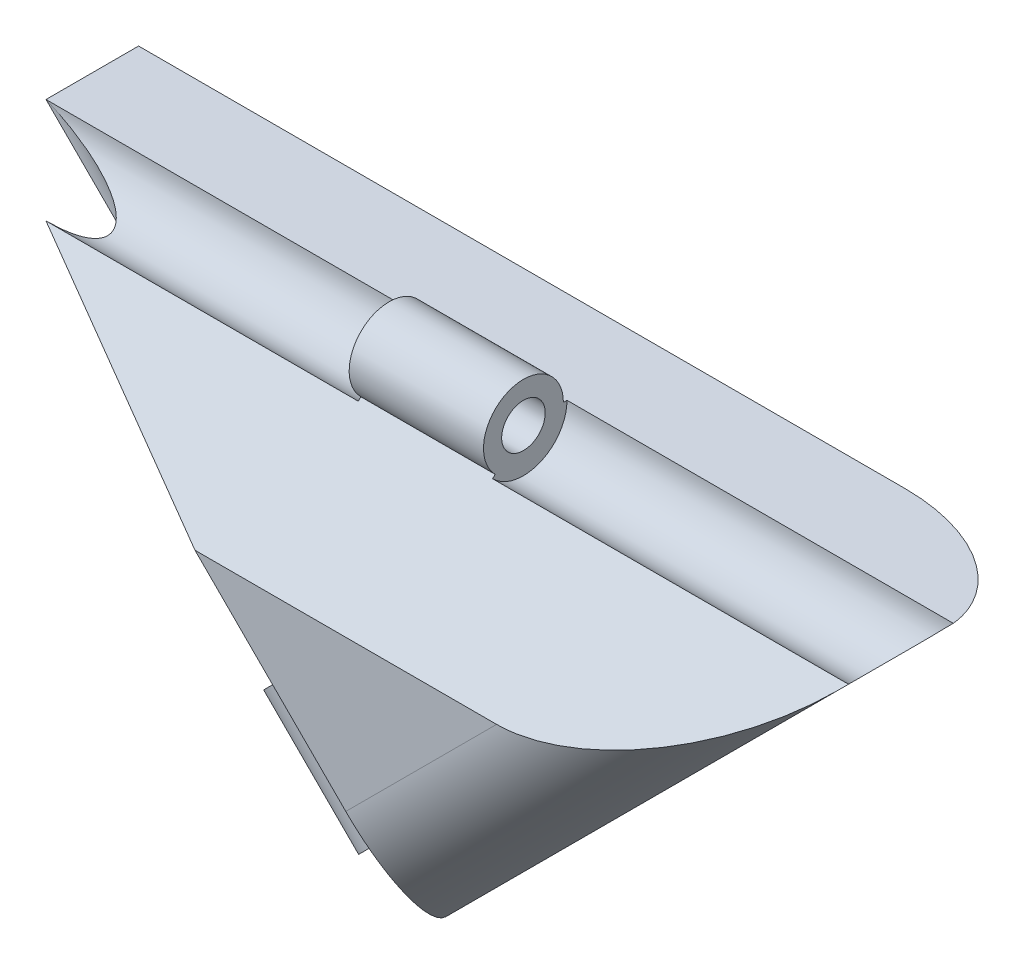
ISO-10303-21;
HEADER;
FILE_DESCRIPTION(('STEP AP214'),'2;1');
FILE_NAME('part.step','',(''),(''),'','','');
FILE_SCHEMA(('AUTOMOTIVE_DESIGN { 1 0 10303 214 1 1 1 1 }'));
ENDSEC;
DATA;
#1=APPLICATION_CONTEXT('core data for automotive mechanical design processes');
#2=APPLICATION_PROTOCOL_DEFINITION('international standard','automotive_design',2000,#1);
#3=PRODUCT_CONTEXT('',#1,'mechanical');
#4=PRODUCT('Part','Part','',(#3));
#5=PRODUCT_RELATED_PRODUCT_CATEGORY('part','',(#4));
#6=PRODUCT_DEFINITION_FORMATION('','',#4);
#7=PRODUCT_DEFINITION_CONTEXT('part definition',#1,'design');
#8=PRODUCT_DEFINITION('design','',#6,#7);
#9=PRODUCT_DEFINITION_SHAPE('','',#8);
#10=(LENGTH_UNIT() NAMED_UNIT(*) SI_UNIT(.MILLI.,.METRE.));
#11=(NAMED_UNIT(*) PLANE_ANGLE_UNIT() SI_UNIT($,.RADIAN.));
#12=(NAMED_UNIT(*) SI_UNIT($,.STERADIAN.) SOLID_ANGLE_UNIT());
#13=UNCERTAINTY_MEASURE_WITH_UNIT(LENGTH_MEASURE(1.E-05),#10,'distance_accuracy_value','');
#14=(GEOMETRIC_REPRESENTATION_CONTEXT(3) GLOBAL_UNCERTAINTY_ASSIGNED_CONTEXT((#13)) GLOBAL_UNIT_ASSIGNED_CONTEXT((#10,
#11,#12)) REPRESENTATION_CONTEXT('',''));
#15=CARTESIAN_POINT('',(0.,0.,0.));
#16=DIRECTION('',(0.,0.,1.));
#17=DIRECTION('',(1.,0.,0.));
#18=AXIS2_PLACEMENT_3D('',#15,#16,#17);
#19=CARTESIAN_POINT('',(-26.0999999999999,9.43333333333339,7.5));
#20=DIRECTION('',(0.707106781186546,-0.707106781186549,0.));
#21=DIRECTION('',(0.707106781186549,0.707106781186546,0.));
#22=AXIS2_PLACEMENT_3D('',#19,#20,#21);
#23=CYLINDRICAL_SURFACE('',#22,2.4);
#24=CARTESIAN_POINT('',(-7.91959594928932,-8.74707071737727,7.5));
#25=DIRECTION('',(0.707106781186547,-0.707106781186549,0.));
#26=DIRECTION('',(0.707106781186549,0.707106781186547,0.));
#27=AXIS2_PLACEMENT_3D('',#24,#25,#26);
#28=CIRCLE('',#27,2.4);
#29=CARTESIAN_POINT('',(-7.91959594928932,-8.74707071737727,5.1));
#30=VERTEX_POINT('',#29);
#31=CARTESIAN_POINT('',(-6.71959594928932,-7.54707071737727,9.19705627484771));
#32=VERTEX_POINT('',#31);
#33=EDGE_CURVE('E203',#30,#32,#28,.T.);
#34=ORIENTED_EDGE('',*,*,#33,.T.);
#35=DIRECTION('',(0.707106781186546,-0.707106781186549,0.));
#36=VECTOR('',#35,1.);
#37=CARTESIAN_POINT('',(-24.8999999999999,10.6333333333334,9.19705627484771));
#38=LINE('',#37,#36);
#39=CARTESIAN_POINT('',(-20.9029437251521,6.6362770584856,9.19705627484771));
#40=VERTEX_POINT('',#39);
#41=EDGE_CURVE('E230',#40,#32,#38,.T.);
#42=ORIENTED_EDGE('',*,*,#41,.F.);
#43=CARTESIAN_POINT('',(-24.9999999999998,8.33333333333331,7.5));
#44=DIRECTION('',(0.38268343236509,0.923879532511286,0.));
#45=DIRECTION('',(0.923879532511287,-0.38268343236509,0.));
#46=AXIS2_PLACEMENT_3D('',#43,#44,#45);
#47=ELLIPSE('',#46,6.27150223140659,2.4);
#48=CARTESIAN_POINT('',(-25.,8.3333333333333,5.1));
#49=VERTEX_POINT('',#48);
#50=EDGE_CURVE('E227',#49,#40,#47,.F.);
#51=ORIENTED_EDGE('',*,*,#50,.F.);
#52=DIRECTION('',(0.707106781186546,-0.707106781186549,0.));
#53=VECTOR('',#52,1.);
#54=CARTESIAN_POINT('',(-26.1,9.4333333333333,5.1));
#55=LINE('',#54,#53);
#56=EDGE_CURVE('E220',#30,#49,#55,.F.);
#57=ORIENTED_EDGE('',*,*,#56,.F.);
#58=EDGE_LOOP('',(#34,#42,#51,#57));
#59=FACE_BOUND('',#58,.T.);
#60=ADVANCED_FACE('F90',(#59),#23,.F.);
#61=CARTESIAN_POINT('',(-25.,8.33333333333331,7.5));
#62=DIRECTION('',(1.,0.,0.));
#63=DIRECTION('',(0.,0.,-1.));
#64=AXIS2_PLACEMENT_3D('',#61,#62,#63);
#65=CYLINDRICAL_SURFACE('',#64,2.4);
#66=DIRECTION('',(1.,0.,0.));
#67=VECTOR('',#66,1.);
#68=CARTESIAN_POINT('',(-25.,8.3333333333333,5.1));
#69=LINE('',#68,#67);
#70=CARTESIAN_POINT('',(-3.7,8.33333333333331,5.1));
#71=VERTEX_POINT('',#70);
#72=EDGE_CURVE('E286',#49,#71,#69,.T.);
#73=ORIENTED_EDGE('',*,*,#72,.F.);
#74=ORIENTED_EDGE('',*,*,#50,.T.);
#75=DIRECTION('',(1.,0.,0.));
#76=VECTOR('',#75,1.);
#77=CARTESIAN_POINT('',(-25.,6.6362770584856,9.19705627484771));
#78=LINE('',#77,#76);
#79=CARTESIAN_POINT('',(-3.7,6.6362770584856,9.19705627484771));
#80=VERTEX_POINT('',#79);
#81=EDGE_CURVE('E268',#80,#40,#78,.F.);
#82=ORIENTED_EDGE('',*,*,#81,.F.);
#83=CARTESIAN_POINT('',(-3.7,8.33333333333331,7.5));
#84=DIRECTION('',(1.,0.,0.));
#85=DIRECTION('',(0.,0.,-1.));
#86=AXIS2_PLACEMENT_3D('',#83,#84,#85);
#87=CIRCLE('',#86,2.4);
#88=EDGE_CURVE('E256',#80,#71,#87,.T.);
#89=ORIENTED_EDGE('',*,*,#88,.T.);
#90=EDGE_LOOP('',(#73,#74,#82,#89));
#91=FACE_BOUND('',#90,.T.);
#92=ADVANCED_FACE('F315',(#91),#65,.F.);
#93=CARTESIAN_POINT('',(-25.,8.3333333333333,15.));
#94=DIRECTION('',(0.,-1.,0.));
#95=DIRECTION('',(1.,0.,0.));
#96=AXIS2_PLACEMENT_3D('',#93,#94,#95);
#97=PLANE('',#96);
#98=CARTESIAN_POINT('',(3.7,8.33333333333331,5.1));
#99=VERTEX_POINT('',#98);
#100=CARTESIAN_POINT('',(24.9794023482358,8.3333333333333,5.1));
#101=VERTEX_POINT('',#100);
#102=EDGE_CURVE('E285',#99,#101,#69,.T.);
#103=ORIENTED_EDGE('',*,*,#102,.T.);
#104=CARTESIAN_POINT('',(17.221825406948,8.33333333333331,5.5));
#105=DIRECTION('',(0.,-1.,0.));
#106=DIRECTION('',(-1.,0.,0.));
#107=AXIS2_PLACEMENT_3D('',#104,#105,#106);
#108=ELLIPSE('',#107,7.77817459305203,5.5);
#109=CARTESIAN_POINT('',(17.221825406948,8.33333333333331,0.));
#110=VERTEX_POINT('',#109);
#111=EDGE_CURVE('E302',#101,#110,#108,.F.);
#112=ORIENTED_EDGE('',*,*,#111,.T.);
#113=DIRECTION('',(-1.,0.,0.));
#114=VECTOR('',#113,1.);
#115=CARTESIAN_POINT('',(-25.,8.3333333333333,0.));
#116=LINE('',#115,#114);
#117=CARTESIAN_POINT('',(-25.,8.3333333333333,0.));
#118=VERTEX_POINT('',#117);
#119=EDGE_CURVE('E279',#110,#118,#116,.T.);
#120=ORIENTED_EDGE('',*,*,#119,.T.);
#121=DIRECTION('',(0.,0.,-1.));
#122=VECTOR('',#121,1.);
#123=CARTESIAN_POINT('',(-25.,8.3333333333333,15.));
#124=LINE('',#123,#122);
#125=EDGE_CURVE('E281',#49,#118,#124,.T.);
#126=ORIENTED_EDGE('',*,*,#125,.F.);
#127=ORIENTED_EDGE('',*,*,#72,.T.);
#128=DIRECTION('',(0.,0.,1.));
#129=VECTOR('',#128,1.);
#130=CARTESIAN_POINT('',(-3.7,8.33333333333331,0.));
#131=LINE('',#130,#129);
#132=CARTESIAN_POINT('',(-3.7,8.33333333333331,5.3));
#133=VERTEX_POINT('',#132);
#134=EDGE_CURVE('E259',#71,#133,#131,.T.);
#135=ORIENTED_EDGE('',*,*,#134,.T.);
#136=DIRECTION('',(1.,0.,0.));
#137=VECTOR('',#136,1.);
#138=CARTESIAN_POINT('',(-3.7,8.33333333333331,5.3));
#139=LINE('',#138,#137);
#140=CARTESIAN_POINT('',(3.7,8.33333333333331,5.3));
#141=VERTEX_POINT('',#140);
#142=EDGE_CURVE('E266',#133,#141,#139,.T.);
#143=ORIENTED_EDGE('',*,*,#142,.T.);
#144=DIRECTION('',(0.,0.,1.));
#145=VECTOR('',#144,1.);
#146=CARTESIAN_POINT('',(3.7,8.33333333333331,0.));
#147=LINE('',#146,#145);
#148=EDGE_CURVE('E245',#99,#141,#147,.T.);
#149=ORIENTED_EDGE('',*,*,#148,.F.);
#150=EDGE_LOOP('',(#103,#112,#120,#126,#127,#135,#143,#149));
#151=FACE_BOUND('',#150,.T.);
#152=ADVANCED_FACE('F325',(#151),#97,.F.);
#153=CARTESIAN_POINT('',(0.,-16.6666666666666,15.));
#154=DIRECTION('',(0.707106781186546,0.707106781186549,0.));
#155=DIRECTION('',(-0.707106781186549,0.707106781186546,0.));
#156=AXIS2_PLACEMENT_3D('',#153,#154,#155);
#157=PLANE('',#156);
#158=DIRECTION('',(0.707106781186549,-0.707106781186546,0.));
#159=VECTOR('',#158,1.);
#160=CARTESIAN_POINT('',(0.,-16.6666666666666,0.));
#161=LINE('',#160,#159);
#162=CARTESIAN_POINT('',(-3.88908729652602,-12.7775793701406,0.));
#163=VERTEX_POINT('',#162);
#164=EDGE_CURVE('E277',#118,#163,#161,.T.);
#165=ORIENTED_EDGE('',*,*,#164,.T.);
#166=CARTESIAN_POINT('',(-3.88908729652602,-12.7775793701406,5.5));
#167=DIRECTION('',(0.707106781186546,0.707106781186549,0.));
#168=DIRECTION('',(-0.707106781186549,0.707106781186546,0.));
#169=AXIS2_PLACEMENT_3D('',#166,#167,#168);
#170=CIRCLE('',#169,5.5);
#171=CARTESIAN_POINT('',(-0.0102988258822018,-16.6563678407846,5.1));
#172=VERTEX_POINT('',#171);
#173=EDGE_CURVE('E370',#163,#172,#170,.F.);
#174=ORIENTED_EDGE('',*,*,#173,.T.);
#175=CARTESIAN_POINT('',(-2.68700576850896,-13.9796608981578,5.1));
#176=VERTEX_POINT('',#175);
#177=EDGE_CURVE('E229',#172,#176,#55,.F.);
#178=ORIENTED_EDGE('',*,*,#177,.T.);
#179=DIRECTION('',(0.,0.,-1.));
#180=VECTOR('',#179,1.);
#181=CARTESIAN_POINT('',(-2.68700576850888,-13.9796608981577,0.));
#182=LINE('',#181,#180);
#183=CARTESIAN_POINT('',(-2.68700576850888,-13.9796608981577,5.3));
#184=VERTEX_POINT('',#183);
#185=EDGE_CURVE('E428',#184,#176,#182,.T.);
#186=ORIENTED_EDGE('',*,*,#185,.F.);
#187=DIRECTION('',(0.707106781186546,-0.707106781186549,0.));
#188=VECTOR('',#187,1.);
#189=CARTESIAN_POINT('',(-7.91959594928932,-8.74707071737727,5.3));
#190=LINE('',#189,#188);
#191=CARTESIAN_POINT('',(-7.91959594928932,-8.74707071737727,5.3));
#192=VERTEX_POINT('',#191);
#193=EDGE_CURVE('E223',#192,#184,#190,.T.);
#194=ORIENTED_EDGE('',*,*,#193,.F.);
#195=DIRECTION('',(0.,0.,-1.));
#196=VECTOR('',#195,1.);
#197=CARTESIAN_POINT('',(-7.91959594928932,-8.74707071737727,0.));
#198=LINE('',#197,#196);
#199=EDGE_CURVE('E207',#192,#30,#198,.T.);
#200=ORIENTED_EDGE('',*,*,#199,.T.);
#201=ORIENTED_EDGE('',*,*,#56,.T.);
#202=ORIENTED_EDGE('',*,*,#125,.T.);
#203=EDGE_LOOP('',(#165,#174,#178,#186,#194,#200,#201,#202));
#204=FACE_BOUND('',#203,.T.);
#205=ADVANCED_FACE('F218',(#204),#157,.F.);
#206=CARTESIAN_POINT('',(0.,-16.6666666666666,15.));
#207=DIRECTION('',(-0.707106781186546,0.707106781186549,0.));
#208=DIRECTION('',(-0.707106781186549,-0.707106781186546,0.));
#209=AXIS2_PLACEMENT_3D('',#206,#207,#208);
#210=PLANE('',#209);
#211=DIRECTION('',(-0.577350269189627,-0.577350269189625,0.577350269189625));
#212=VECTOR('',#211,1.);
#213=CARTESIAN_POINT('',(5.83333333333331,-10.8333333333333,26.6666666666666));
#214=LINE('',#213,#212);
#215=CARTESIAN_POINT('',(23.3029437251523,6.6362770584856,9.19705627484771));
#216=VERTEX_POINT('',#215);
#217=CARTESIAN_POINT('',(23.,6.3333333333333,9.50000000000001));
#218=VERTEX_POINT('',#217);
#219=EDGE_CURVE('E273',#216,#218,#214,.T.);
#220=ORIENTED_EDGE('',*,*,#219,.T.);
#221=DIRECTION('',(0.707106781186549,0.707106781186546,0.));
#222=VECTOR('',#221,1.);
#223=CARTESIAN_POINT('',(0.,-16.6666666666666,9.5));
#224=LINE('',#223,#222);
#225=CARTESIAN_POINT('',(1.4142135623731,-15.2524531042935,9.5));
#226=VERTEX_POINT('',#225);
#227=EDGE_CURVE('E98',#218,#226,#224,.F.);
#228=ORIENTED_EDGE('',*,*,#227,.T.);
#229=DIRECTION('',(0.500000000000001,0.499999999999999,0.707106781186548));
#230=VECTOR('',#229,1.);
#231=CARTESIAN_POINT('',(1.5150162372171,-15.1516504294495,9.64255650988787));
#232=LINE('',#231,#230);
#233=CARTESIAN_POINT('',(1.20000000000001,-15.4666666666666,9.19705627484771));
#234=VERTEX_POINT('',#233);
#235=EDGE_CURVE('E412',#234,#226,#232,.T.);
#236=ORIENTED_EDGE('',*,*,#235,.F.);
#237=CARTESIAN_POINT('',(0.,-16.6666666666666,7.5));
#238=DIRECTION('',(0.707106781186546,-0.707106781186549,0.));
#239=DIRECTION('',(0.707106781186549,0.707106781186546,0.));
#240=AXIS2_PLACEMENT_3D('',#237,#238,#239);
#241=CIRCLE('',#240,2.4);
#242=CARTESIAN_POINT('',(0.938083151964687,-15.7285835147019,5.5));
#243=VERTEX_POINT('',#242);
#244=EDGE_CURVE('E414',#243,#234,#241,.T.);
#245=ORIENTED_EDGE('',*,*,#244,.F.);
#246=DIRECTION('',(0.707106781186549,0.707106781186546,0.));
#247=VECTOR('',#246,1.);
#248=CARTESIAN_POINT('',(25.,8.33333333333331,5.5));
#249=LINE('',#248,#247);
#250=CARTESIAN_POINT('',(23.6733500838578,7.00668341719115,5.5));
#251=VERTEX_POINT('',#250);
#252=EDGE_CURVE('E292',#243,#251,#249,.T.);
#253=ORIENTED_EDGE('',*,*,#252,.T.);
#254=CARTESIAN_POINT('',(25.,8.33333333333331,7.5));
#255=DIRECTION('',(-0.707106781186546,0.707106781186549,0.));
#256=DIRECTION('',(0.707106781186549,0.707106781186546,0.));
#257=AXIS2_PLACEMENT_3D('',#254,#255,#256);
#258=ELLIPSE('',#257,3.39411254969543,2.4);
#259=EDGE_CURVE('E275',#251,#216,#258,.T.);
#260=ORIENTED_EDGE('',*,*,#259,.T.);
#261=EDGE_LOOP('',(#220,#228,#236,#245,#253,#260));
#262=FACE_BOUND('',#261,.T.);
#263=ADVANCED_FACE('F320',(#262),#210,.F.);
#264=CARTESIAN_POINT('',(0.,0.,15.));
#265=DIRECTION('',(0.,0.,-1.));
#266=DIRECTION('',(-1.,0.,0.));
#267=AXIS2_PLACEMENT_3D('',#264,#265,#266);
#268=PLANE('',#267);
#269=DIRECTION('',(0.707106781186546,-0.707106781186549,0.));
#270=VECTOR('',#269,1.);
#271=CARTESIAN_POINT('',(-20.7966991411008,14.7366341922325,15.));
#272=LINE('',#271,#270);
#273=CARTESIAN_POINT('',(-6.89339828220169,0.833333333333312,15.));
#274=VERTEX_POINT('',#273);
#275=CARTESIAN_POINT('',(1.41421356237311,-7.47427851124149,15.));
#276=VERTEX_POINT('',#275);
#277=EDGE_CURVE('E410',#274,#276,#272,.T.);
#278=ORIENTED_EDGE('',*,*,#277,.T.);
#279=DIRECTION('',(0.707106781186549,0.707106781186546,0.));
#280=VECTOR('',#279,1.);
#281=CARTESIAN_POINT('',(4.4442460368073,-4.44424603680731,15.));
#282=LINE('',#281,#280);
#283=CARTESIAN_POINT('',(9.72182540694794,0.833333333333309,15.));
#284=VERTEX_POINT('',#283);
#285=EDGE_CURVE('E371',#276,#284,#282,.T.);
#286=ORIENTED_EDGE('',*,*,#285,.T.);
#287=DIRECTION('',(-1.,0.,0.));
#288=VECTOR('',#287,1.);
#289=CARTESIAN_POINT('',(0.,0.833333333333309,15.));
#290=LINE('',#289,#288);
#291=EDGE_CURVE('E283',#284,#274,#290,.T.);
#292=ORIENTED_EDGE('',*,*,#291,.T.);
#293=EDGE_LOOP('',(#278,#286,#292));
#294=FACE_BOUND('',#293,.T.);
#295=ADVANCED_FACE('F317',(#294),#268,.F.);
#296=CARTESIAN_POINT('',(0.,0.,0.));
#297=DIRECTION('',(0.,0.,-1.));
#298=DIRECTION('',(-1.,0.,0.));
#299=AXIS2_PLACEMENT_3D('',#296,#297,#298);
#300=PLANE('',#299);
#301=ORIENTED_EDGE('',*,*,#119,.F.);
#302=DIRECTION('',(0.707106781186549,0.707106781186546,0.));
#303=VECTOR('',#302,1.);
#304=CARTESIAN_POINT('',(-3.88908729652601,-12.7775793701406,0.));
#305=LINE('',#304,#303);
#306=EDGE_CURVE('E375',#110,#163,#305,.F.);
#307=ORIENTED_EDGE('',*,*,#306,.T.);
#308=ORIENTED_EDGE('',*,*,#164,.F.);
#309=EDGE_LOOP('',(#301,#307,#308));
#310=FACE_BOUND('',#309,.T.);
#311=ADVANCED_FACE('F313',(#310),#300,.T.);
#312=ORIENTED_EDGE('',*,*,#259,.F.);
#313=CARTESIAN_POINT('',(23.6733500838578,7.00668341719115,5.5));
#314=CARTESIAN_POINT('',(23.7387919494954,7.07214774557773,5.45657079463884));
#315=CARTESIAN_POINT('',(23.8050751853829,7.13913650583393,5.41676772915438));
#316=CARTESIAN_POINT('',(23.9391433361342,7.27541688050346,5.34436617503535));
#317=CARTESIAN_POINT('',(24.0069277225778,7.34470768873752,5.31176519419037));
#318=CARTESIAN_POINT('',(24.1428652949624,7.48387145875718,5.25411309121256));
#319=CARTESIAN_POINT('',(24.210998723787,7.55372123571414,5.22895890493082));
#320=CARTESIAN_POINT('',(24.3483933643464,7.69439731542363,5.18544176149465));
#321=CARTESIAN_POINT('',(24.4176544700075,7.76522352623409,5.16707816940008));
#322=CARTESIAN_POINT('',(24.5680451484437,7.9185189856026,5.134625173781));
#323=CARTESIAN_POINT('',(24.649332135739,8.00107177108865,5.12165815811523));
#324=CARTESIAN_POINT('',(24.8134635535214,8.16695142468911,5.10431262349346));
#325=CARTESIAN_POINT('',(24.896315364427,8.25027885078479,5.10000883619813));
#326=CARTESIAN_POINT('',(24.9794023482358,8.3333333333333,5.1));
#327=B_SPLINE_CURVE_WITH_KNOTS('',3,(#313,#314,#315,#316,#317,#318,#319,#320,#321,#322,#323,
#324,#325,#326),.UNSPECIFIED.,.F.,.F.,(4,2,2,2,2,2,4),(0.,0.306623517377546,0.613140763928503,
0.915192824981067,1.21721663614893,1.56661895290121,1.91902262217088),.UNSPECIFIED.);
#328=EDGE_CURVE('E295',#251,#101,#327,.T.);
#329=ORIENTED_EDGE('',*,*,#328,.T.);
#330=ORIENTED_EDGE('',*,*,#102,.F.);
#331=CARTESIAN_POINT('',(3.7,8.33333333333331,7.5));
#332=DIRECTION('',(1.,0.,0.));
#333=DIRECTION('',(0.,0.,-1.));
#334=AXIS2_PLACEMENT_3D('',#331,#332,#333);
#335=CIRCLE('',#334,2.4);
#336=CARTESIAN_POINT('',(3.7,6.6362770584856,9.19705627484771));
#337=VERTEX_POINT('',#336);
#338=EDGE_CURVE('E243',#337,#99,#335,.T.);
#339=ORIENTED_EDGE('',*,*,#338,.F.);
#340=EDGE_CURVE('E270',#216,#337,#78,.F.);
#341=ORIENTED_EDGE('',*,*,#340,.F.);
#342=EDGE_LOOP('',(#312,#329,#330,#339,#341));
#343=FACE_BOUND('',#342,.T.);
#344=ADVANCED_FACE('F307',(#343),#65,.F.);
#345=CARTESIAN_POINT('',(-25.,7.91666666666665,7.91666666666666));
#346=DIRECTION('',(0.,-0.707106781186547,-0.707106781186548));
#347=DIRECTION('',(0.,0.707106781186548,-0.707106781186547));
#348=AXIS2_PLACEMENT_3D('',#345,#346,#347);
#349=PLANE('',#348);
#350=ORIENTED_EDGE('',*,*,#291,.F.);
#351=CARTESIAN_POINT('',(15.221825406948,6.33333333333331,9.5));
#352=DIRECTION('',(0.,-0.707106781186547,-0.707106781186548));
#353=DIRECTION('',(0.816496580927727,0.408248290463862,-0.408248290463862));
#354=AXIS2_PLACEMENT_3D('',#351,#352,#353);
#355=ELLIPSE('',#354,11.,5.5);
#356=EDGE_CURVE('E112',#284,#218,#355,.F.);
#357=ORIENTED_EDGE('',*,*,#356,.T.);
#358=ORIENTED_EDGE('',*,*,#219,.F.);
#359=ORIENTED_EDGE('',*,*,#340,.T.);
#360=DIRECTION('',(0.,0.707106781186548,-0.707106781186547));
#361=VECTOR('',#360,1.);
#362=CARTESIAN_POINT('',(3.7,7.91666666666665,7.91666666666666));
#363=LINE('',#362,#361);
#364=CARTESIAN_POINT('',(3.7,6.77769841472291,9.05563491861041));
#365=VERTEX_POINT('',#364);
#366=EDGE_CURVE('E240',#337,#365,#363,.T.);
#367=ORIENTED_EDGE('',*,*,#366,.T.);
#368=DIRECTION('',(1.,0.,0.));
#369=VECTOR('',#368,1.);
#370=CARTESIAN_POINT('',(-3.7,6.77769841472291,9.05563491861041));
#371=LINE('',#370,#369);
#372=CARTESIAN_POINT('',(-3.7,6.77769841472291,9.05563491861041));
#373=VERTEX_POINT('',#372);
#374=EDGE_CURVE('E265',#373,#365,#371,.T.);
#375=ORIENTED_EDGE('',*,*,#374,.F.);
#376=DIRECTION('',(0.,0.707106781186548,-0.707106781186547));
#377=VECTOR('',#376,1.);
#378=CARTESIAN_POINT('',(-3.7,7.91666666666665,7.91666666666666));
#379=LINE('',#378,#377);
#380=EDGE_CURVE('E254',#80,#373,#379,.T.);
#381=ORIENTED_EDGE('',*,*,#380,.F.);
#382=ORIENTED_EDGE('',*,*,#81,.T.);
#383=DIRECTION('',(0.862856209461016,-0.357406744336594,0.357406744336594));
#384=VECTOR('',#383,1.);
#385=CARTESIAN_POINT('',(-24.7430078094549,8.22688368258563,7.60644965074768));
#386=LINE('',#385,#384);
#387=EDGE_CURVE('E289',#40,#274,#386,.T.);
#388=ORIENTED_EDGE('',*,*,#387,.T.);
#389=EDGE_LOOP('',(#350,#357,#358,#359,#367,#375,#381,#382,#388));
#390=FACE_BOUND('',#389,.T.);
#391=ADVANCED_FACE('F312',(#390),#349,.F.);
#392=CARTESIAN_POINT('',(-3.7,8.33333333333331,7.5));
#393=DIRECTION('',(1.,0.,0.));
#394=DIRECTION('',(0.,0.,-1.));
#395=AXIS2_PLACEMENT_3D('',#392,#393,#394);
#396=CYLINDRICAL_SURFACE('',#395,2.2);
#397=ORIENTED_EDGE('',*,*,#374,.T.);
#398=CARTESIAN_POINT('',(3.7,8.33333333333331,7.5));
#399=DIRECTION('',(1.,0.,0.));
#400=DIRECTION('',(0.,0.,-1.));
#401=AXIS2_PLACEMENT_3D('',#398,#399,#400);
#402=CIRCLE('',#401,2.2);
#403=EDGE_CURVE('E237',#141,#365,#402,.T.);
#404=ORIENTED_EDGE('',*,*,#403,.F.);
#405=ORIENTED_EDGE('',*,*,#142,.F.);
#406=CARTESIAN_POINT('',(-3.7,8.33333333333331,7.5));
#407=DIRECTION('',(1.,0.,0.));
#408=DIRECTION('',(0.,0.,-1.));
#409=AXIS2_PLACEMENT_3D('',#406,#407,#408);
#410=CIRCLE('',#409,2.2);
#411=EDGE_CURVE('E251',#133,#373,#410,.T.);
#412=ORIENTED_EDGE('',*,*,#411,.T.);
#413=EDGE_LOOP('',(#397,#404,#405,#412));
#414=FACE_BOUND('',#413,.T.);
#415=ADVANCED_FACE('F399',(#414),#396,.T.);
#416=CARTESIAN_POINT('',(-3.7,8.33333333333331,7.5));
#417=DIRECTION('',(1.,0.,0.));
#418=DIRECTION('',(0.,0.,-1.));
#419=AXIS2_PLACEMENT_3D('',#416,#417,#418);
#420=CYLINDRICAL_SURFACE('',#419,1.2);
#421=CARTESIAN_POINT('',(-3.7,8.33333333333331,7.5));
#422=DIRECTION('',(1.,0.,0.));
#423=DIRECTION('',(0.,0.,-1.));
#424=AXIS2_PLACEMENT_3D('',#421,#422,#423);
#425=CIRCLE('',#424,1.2);
#426=CARTESIAN_POINT('',(-3.7,8.33333333333331,6.3));
#427=VERTEX_POINT('',#426);
#428=EDGE_CURVE('E262',#427,#427,#425,.T.);
#429=ORIENTED_EDGE('',*,*,#428,.F.);
#430=EDGE_LOOP('',(#429));
#431=FACE_BOUND('',#430,.T.);
#432=CARTESIAN_POINT('',(3.7,8.33333333333331,7.5));
#433=DIRECTION('',(1.,0.,0.));
#434=DIRECTION('',(0.,0.,-1.));
#435=AXIS2_PLACEMENT_3D('',#432,#433,#434);
#436=CIRCLE('',#435,1.2);
#437=CARTESIAN_POINT('',(3.7,8.33333333333331,6.3));
#438=VERTEX_POINT('',#437);
#439=EDGE_CURVE('E248',#438,#438,#436,.T.);
#440=ORIENTED_EDGE('',*,*,#439,.T.);
#441=EDGE_LOOP('',(#440));
#442=FACE_BOUND('',#441,.T.);
#443=ADVANCED_FACE('F514',(#431,#442),#420,.F.);
#444=CARTESIAN_POINT('',(-3.7,0.,0.));
#445=DIRECTION('',(1.,0.,0.));
#446=DIRECTION('',(0.,0.,-1.));
#447=AXIS2_PLACEMENT_3D('',#444,#445,#446);
#448=PLANE('',#447);
#449=ORIENTED_EDGE('',*,*,#411,.F.);
#450=ORIENTED_EDGE('',*,*,#134,.F.);
#451=ORIENTED_EDGE('',*,*,#88,.F.);
#452=ORIENTED_EDGE('',*,*,#380,.T.);
#453=EDGE_LOOP('',(#449,#450,#451,#452));
#454=FACE_BOUND('',#453,.T.);
#455=ORIENTED_EDGE('',*,*,#428,.T.);
#456=EDGE_LOOP('',(#455));
#457=FACE_BOUND('',#456,.T.);
#458=ADVANCED_FACE('F394',(#454,#457),#448,.F.);
#459=CARTESIAN_POINT('',(3.7,0.,0.));
#460=DIRECTION('',(1.,0.,0.));
#461=DIRECTION('',(0.,0.,-1.));
#462=AXIS2_PLACEMENT_3D('',#459,#460,#461);
#463=PLANE('',#462);
#464=ORIENTED_EDGE('',*,*,#403,.T.);
#465=ORIENTED_EDGE('',*,*,#366,.F.);
#466=ORIENTED_EDGE('',*,*,#338,.T.);
#467=ORIENTED_EDGE('',*,*,#148,.T.);
#468=EDGE_LOOP('',(#464,#465,#466,#467));
#469=FACE_BOUND('',#468,.T.);
#470=ORIENTED_EDGE('',*,*,#439,.F.);
#471=EDGE_LOOP('',(#470));
#472=FACE_BOUND('',#471,.T.);
#473=ADVANCED_FACE('F355',(#469,#472),#463,.T.);
#474=CARTESIAN_POINT('',(-24.5849837627828,10.9483495705505,9.64255650988787));
#475=DIRECTION('',(0.500000000000001,0.499999999999999,-0.707106781186547));
#476=DIRECTION('',(-0.816496580927726,0.,-0.577350269189626));
#477=AXIS2_PLACEMENT_3D('',#474,#475,#476);
#478=PLANE('',#477);
#479=ORIENTED_EDGE('',*,*,#235,.T.);
#480=CARTESIAN_POINT('',(-2.4748737341529,-11.3633658077675,9.5));
#481=DIRECTION('',(0.500000000000001,0.499999999999999,-0.707106781186547));
#482=DIRECTION('',(0.500000000000001,0.499999999999999,0.707106781186548));
#483=AXIS2_PLACEMENT_3D('',#480,#481,#482);
#484=ELLIPSE('',#483,7.77817459305202,5.5);
#485=EDGE_CURVE('E12',#226,#276,#484,.F.);
#486=ORIENTED_EDGE('',*,*,#485,.T.);
#487=ORIENTED_EDGE('',*,*,#277,.F.);
#488=ORIENTED_EDGE('',*,*,#387,.F.);
#489=ORIENTED_EDGE('',*,*,#41,.T.);
#490=DIRECTION('',(0.500000000000001,0.499999999999999,0.707106781186548));
#491=VECTOR('',#490,1.);
#492=CARTESIAN_POINT('',(-6.40457971207222,-7.23205448016017,9.64255650988787));
#493=LINE('',#492,#491);
#494=CARTESIAN_POINT('',(-6.81959594928932,-7.64707071737727,9.0556349186104));
#495=VERTEX_POINT('',#494);
#496=EDGE_CURVE('E210',#495,#32,#493,.T.);
#497=ORIENTED_EDGE('',*,*,#496,.F.);
#498=DIRECTION('',(0.707106781186546,-0.707106781186549,0.));
#499=VECTOR('',#498,1.);
#500=CARTESIAN_POINT('',(-6.81959594928932,-7.64707071737727,9.0556349186104));
#501=LINE('',#500,#499);
#502=CARTESIAN_POINT('',(-1.58700576850887,-12.8796608981577,9.0556349186104));
#503=VERTEX_POINT('',#502);
#504=EDGE_CURVE('E417',#495,#503,#501,.T.);
#505=ORIENTED_EDGE('',*,*,#504,.T.);
#506=DIRECTION('',(0.500000000000001,0.499999999999999,0.707106781186548));
#507=VECTOR('',#506,1.);
#508=CARTESIAN_POINT('',(-1.17198953129178,-12.4646446609406,9.64255650988787));
#509=LINE('',#508,#507);
#510=CARTESIAN_POINT('',(-1.48700576850887,-12.7796608981577,9.19705627484771));
#511=VERTEX_POINT('',#510);
#512=EDGE_CURVE('E425',#503,#511,#509,.T.);
#513=ORIENTED_EDGE('',*,*,#512,.T.);
#514=EDGE_CURVE('E232',#511,#234,#38,.T.);
#515=ORIENTED_EDGE('',*,*,#514,.T.);
#516=EDGE_LOOP('',(#479,#486,#487,#488,#489,#497,#505,#513,#515));
#517=FACE_BOUND('',#516,.T.);
#518=ADVANCED_FACE('F346',(#517),#478,.F.);
#519=ORIENTED_EDGE('',*,*,#177,.F.);
#520=CARTESIAN_POINT('',(-0.0102988258822031,-16.6563678407846,5.1));
#521=CARTESIAN_POINT('',(0.0379604348109701,-16.6080940191223,5.09999259998611));
#522=CARTESIAN_POINT('',(0.0863830439595294,-16.5599858914662,5.10291188265113));
#523=CARTESIAN_POINT('',(0.18315686626728,-16.4643932157279,5.11454985139919));
#524=CARTESIAN_POINT('',(0.231508071724825,-16.4169087310922,5.12326912295588));
#525=CARTESIAN_POINT('',(0.326575918628868,-16.3239944008813,5.1461747610171));
#526=CARTESIAN_POINT('',(0.373303932297515,-16.2785425973326,5.16022483478366));
#527=CARTESIAN_POINT('',(0.465872739340556,-16.1887575208012,5.19368760475303));
#528=CARTESIAN_POINT('',(0.511713743132905,-16.1444239817651,5.21309901202057));
#529=CARTESIAN_POINT('',(0.623738650133733,-16.0361281391556,5.26771993436231));
#530=CARTESIAN_POINT('',(0.689161458617033,-15.9729235126057,5.30604444569582));
#531=CARTESIAN_POINT('',(0.816821966403285,-15.8486548612627,5.39434712751619));
#532=CARTESIAN_POINT('',(0.878980073012005,-15.7876506938684,5.444524613463));
#533=CARTESIAN_POINT('',(0.938083151964687,-15.7285835147019,5.5));
#534=B_SPLINE_CURVE_WITH_KNOTS('',3,(#520,#521,#522,#523,#524,#525,#526,#527,#528,#529,#530,
#531,#532,#533),.UNSPECIFIED.,.F.,.F.,(4,2,2,2,2,2,4),(0.,0.204712355031425,0.40944537766849,
0.609262715152423,0.809032055666003,1.10438518957234,1.40511125946878),.UNSPECIFIED.);
#535=EDGE_CURVE('E360',#172,#243,#534,.T.);
#536=ORIENTED_EDGE('',*,*,#535,.T.);
#537=ORIENTED_EDGE('',*,*,#244,.T.);
#538=ORIENTED_EDGE('',*,*,#514,.F.);
#539=CARTESIAN_POINT('',(-2.68700576850888,-13.9796608981577,7.5));
#540=DIRECTION('',(0.707106781186547,-0.707106781186549,0.));
#541=DIRECTION('',(0.707106781186549,0.707106781186547,0.));
#542=AXIS2_PLACEMENT_3D('',#539,#540,#541);
#543=CIRCLE('',#542,2.4);
#544=EDGE_CURVE('E364',#176,#511,#543,.T.);
#545=ORIENTED_EDGE('',*,*,#544,.F.);
#546=EDGE_LOOP('',(#519,#536,#537,#538,#545));
#547=FACE_BOUND('',#546,.T.);
#548=ADVANCED_FACE('F335',(#547),#23,.F.);
#549=CARTESIAN_POINT('',(-7.91959594928932,-8.74707071737727,7.5));
#550=DIRECTION('',(0.707106781186546,-0.707106781186549,0.));
#551=DIRECTION('',(0.707106781186549,0.707106781186546,0.));
#552=AXIS2_PLACEMENT_3D('',#549,#550,#551);
#553=CYLINDRICAL_SURFACE('',#552,2.2);
#554=CARTESIAN_POINT('',(-2.68700576850888,-13.9796608981577,7.5));
#555=DIRECTION('',(0.707106781186547,-0.707106781186549,0.));
#556=DIRECTION('',(0.707106781186549,0.707106781186547,0.));
#557=AXIS2_PLACEMENT_3D('',#554,#555,#556);
#558=CIRCLE('',#557,2.2);
#559=EDGE_CURVE('E422',#503,#184,#558,.T.);
#560=ORIENTED_EDGE('',*,*,#559,.F.);
#561=ORIENTED_EDGE('',*,*,#504,.F.);
#562=CARTESIAN_POINT('',(-7.91959594928932,-8.74707071737727,7.5));
#563=DIRECTION('',(0.707106781186547,-0.707106781186549,0.));
#564=DIRECTION('',(0.707106781186549,0.707106781186547,0.));
#565=AXIS2_PLACEMENT_3D('',#562,#563,#564);
#566=CIRCLE('',#565,2.2);
#567=EDGE_CURVE('E420',#495,#192,#566,.T.);
#568=ORIENTED_EDGE('',*,*,#567,.T.);
#569=ORIENTED_EDGE('',*,*,#193,.T.);
#570=EDGE_LOOP('',(#560,#561,#568,#569));
#571=FACE_BOUND('',#570,.T.);
#572=ADVANCED_FACE('F345',(#571),#553,.T.);
#573=CARTESIAN_POINT('',(-7.91959594928932,-8.74707071737727,7.5));
#574=DIRECTION('',(0.707106781186546,-0.707106781186549,0.));
#575=DIRECTION('',(0.707106781186549,0.707106781186546,0.));
#576=AXIS2_PLACEMENT_3D('',#573,#574,#575);
#577=CYLINDRICAL_SURFACE('',#576,1.2);
#578=CARTESIAN_POINT('',(-7.91959594928932,-8.74707071737727,7.5));
#579=DIRECTION('',(0.707106781186547,-0.707106781186549,0.));
#580=DIRECTION('',(0.707106781186549,0.707106781186547,0.));
#581=AXIS2_PLACEMENT_3D('',#578,#579,#580);
#582=CIRCLE('',#581,1.2);
#583=CARTESIAN_POINT('',(-7.07106781186546,-7.89854257995341,7.5));
#584=VERTEX_POINT('',#583);
#585=EDGE_CURVE('E224',#584,#584,#582,.T.);
#586=ORIENTED_EDGE('',*,*,#585,.F.);
#587=EDGE_LOOP('',(#586));
#588=FACE_BOUND('',#587,.T.);
#589=CARTESIAN_POINT('',(-2.68700576850887,-13.9796608981577,7.5));
#590=DIRECTION('',(0.707106781186547,-0.707106781186549,0.));
#591=DIRECTION('',(0.707106781186549,0.707106781186547,0.));
#592=AXIS2_PLACEMENT_3D('',#589,#590,#591);
#593=CIRCLE('',#592,1.2);
#594=CARTESIAN_POINT('',(-1.83847763108502,-13.1311327607339,7.5));
#595=VERTEX_POINT('',#594);
#596=EDGE_CURVE('E430',#595,#595,#593,.T.);
#597=ORIENTED_EDGE('',*,*,#596,.T.);
#598=EDGE_LOOP('',(#597));
#599=FACE_BOUND('',#598,.T.);
#600=ADVANCED_FACE('F351',(#588,#599),#577,.F.);
#601=CARTESIAN_POINT('',(0.413737384043985,-0.413737384043986,0.));
#602=DIRECTION('',(0.707106781186547,-0.707106781186549,0.));
#603=DIRECTION('',(0.707106781186549,0.707106781186547,0.));
#604=AXIS2_PLACEMENT_3D('',#601,#602,#603);
#605=PLANE('',#604);
#606=ORIENTED_EDGE('',*,*,#585,.T.);
#607=EDGE_LOOP('',(#606));
#608=FACE_BOUND('',#607,.T.);
#609=ORIENTED_EDGE('',*,*,#199,.F.);
#610=ORIENTED_EDGE('',*,*,#567,.F.);
#611=ORIENTED_EDGE('',*,*,#496,.T.);
#612=ORIENTED_EDGE('',*,*,#33,.F.);
#613=EDGE_LOOP('',(#609,#610,#611,#612));
#614=FACE_BOUND('',#613,.T.);
#615=ADVANCED_FACE('F205',(#608,#614),#605,.F.);
#616=CARTESIAN_POINT('',(5.64632756482443,-5.64632756482445,0.));
#617=DIRECTION('',(0.707106781186547,-0.707106781186549,0.));
#618=DIRECTION('',(0.707106781186549,0.707106781186547,0.));
#619=AXIS2_PLACEMENT_3D('',#616,#617,#618);
#620=PLANE('',#619);
#621=ORIENTED_EDGE('',*,*,#596,.F.);
#622=EDGE_LOOP('',(#621));
#623=FACE_BOUND('',#622,.T.);
#624=ORIENTED_EDGE('',*,*,#185,.T.);
#625=ORIENTED_EDGE('',*,*,#544,.T.);
#626=ORIENTED_EDGE('',*,*,#512,.F.);
#627=ORIENTED_EDGE('',*,*,#559,.T.);
#628=EDGE_LOOP('',(#624,#625,#626,#627));
#629=FACE_BOUND('',#628,.T.);
#630=ADVANCED_FACE('F444',(#623,#629),#620,.T.);
#631=CARTESIAN_POINT('',(-3.88908729652601,-12.7775793701406,5.5));
#632=DIRECTION('',(-0.707106781186549,-0.707106781186546,0.));
#633=DIRECTION('',(0.707106781186546,-0.707106781186549,0.));
#634=AXIS2_PLACEMENT_3D('',#631,#632,#633);
#635=CYLINDRICAL_SURFACE('',#634,5.5);
#636=ORIENTED_EDGE('',*,*,#173,.F.);
#637=ORIENTED_EDGE('',*,*,#306,.F.);
#638=ORIENTED_EDGE('',*,*,#111,.F.);
#639=ORIENTED_EDGE('',*,*,#328,.F.);
#640=ORIENTED_EDGE('',*,*,#252,.F.);
#641=ORIENTED_EDGE('',*,*,#535,.F.);
#642=EDGE_LOOP('',(#636,#637,#638,#639,#640,#641));
#643=FACE_BOUND('',#642,.T.);
#644=ADVANCED_FACE('F304',(#643),#635,.T.);
#645=CARTESIAN_POINT('',(4.4442460368073,-4.44424603680731,9.5));
#646=DIRECTION('',(0.707106781186549,0.707106781186546,0.));
#647=DIRECTION('',(-0.707106781186546,0.707106781186549,0.));
#648=AXIS2_PLACEMENT_3D('',#645,#646,#647);
#649=CYLINDRICAL_SURFACE('',#648,5.5);
#650=ORIENTED_EDGE('',*,*,#485,.F.);
#651=ORIENTED_EDGE('',*,*,#227,.F.);
#652=ORIENTED_EDGE('',*,*,#356,.F.);
#653=ORIENTED_EDGE('',*,*,#285,.F.);
#654=EDGE_LOOP('',(#650,#651,#652,#653));
#655=FACE_BOUND('',#654,.T.);
#656=ADVANCED_FACE('F92',(#655),#649,.T.);
#657=CLOSED_SHELL('',(#60,#92,#152,#205,#263,#295,#311,#344,#391,#415,#443,#458,#473,#518,#548,
#572,#600,#615,#630,#644,#656));
#658=MANIFOLD_SOLID_BREP('B2',#657);
#659=ADVANCED_BREP_SHAPE_REPRESENTATION('',(#18,#658),#14);
#660=SHAPE_DEFINITION_REPRESENTATION(#9,#659);
ENDSEC;
END-ISO-10303-21;
